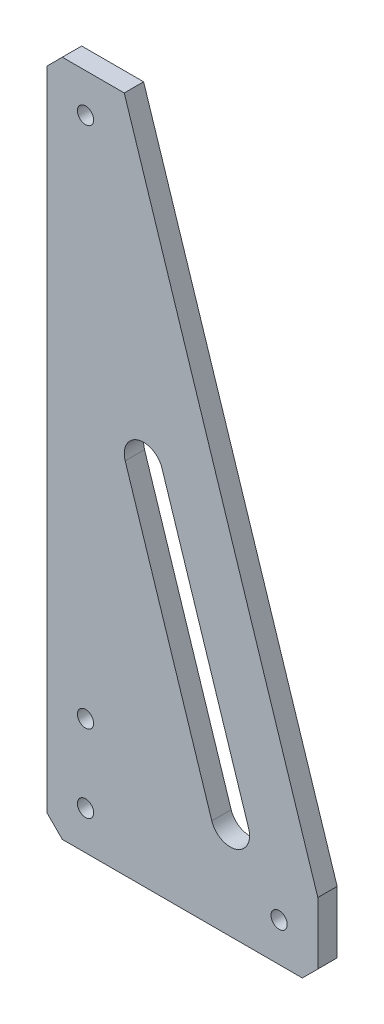
ISO-10303-21;
HEADER;
FILE_DESCRIPTION(('STEP AP214'),'2;1');
FILE_NAME('part.step','',(''),(''),'','','');
FILE_SCHEMA(('AUTOMOTIVE_DESIGN { 1 0 10303 214 1 1 1 1 }'));
ENDSEC;
DATA;
#1=APPLICATION_CONTEXT('core data for automotive mechanical design processes');
#2=APPLICATION_PROTOCOL_DEFINITION('international standard','automotive_design',2000,#1);
#3=PRODUCT_CONTEXT('',#1,'mechanical');
#4=PRODUCT('Part','Part','',(#3));
#5=PRODUCT_RELATED_PRODUCT_CATEGORY('part','',(#4));
#6=PRODUCT_DEFINITION_FORMATION('','',#4);
#7=PRODUCT_DEFINITION_CONTEXT('part definition',#1,'design');
#8=PRODUCT_DEFINITION('design','',#6,#7);
#9=PRODUCT_DEFINITION_SHAPE('','',#8);
#10=(LENGTH_UNIT() NAMED_UNIT(*) SI_UNIT(.MILLI.,.METRE.));
#11=(NAMED_UNIT(*) PLANE_ANGLE_UNIT() SI_UNIT($,.RADIAN.));
#12=(NAMED_UNIT(*) SI_UNIT($,.STERADIAN.) SOLID_ANGLE_UNIT());
#13=UNCERTAINTY_MEASURE_WITH_UNIT(LENGTH_MEASURE(1.E-05),#10,'distance_accuracy_value','');
#14=(GEOMETRIC_REPRESENTATION_CONTEXT(3) GLOBAL_UNCERTAINTY_ASSIGNED_CONTEXT((#13)) GLOBAL_UNIT_ASSIGNED_CONTEXT((#10,
#11,#12)) REPRESENTATION_CONTEXT('',''));
#15=CARTESIAN_POINT('',(0.,0.,0.));
#16=DIRECTION('',(0.,0.,1.));
#17=DIRECTION('',(1.,0.,0.));
#18=AXIS2_PLACEMENT_3D('',#15,#16,#17);
#19=CARTESIAN_POINT('',(0.,0.,2.5));
#20=DIRECTION('',(0.,0.,1.));
#21=DIRECTION('',(1.,0.,0.));
#22=AXIS2_PLACEMENT_3D('',#19,#20,#21);
#23=PLANE('',#22);
#24=CARTESIAN_POINT('',(12.3722613227067,-62.5,2.5));
#25=DIRECTION('',(0.,0.,-1.));
#26=DIRECTION('',(-1.,0.,0.));
#27=AXIS2_PLACEMENT_3D('',#24,#25,#26);
#28=CIRCLE('',#27,5.);
#29=CARTESIAN_POINT('',(17.1308044115095,-60.9649861003862,2.5));
#30=VERTEX_POINT('',#29);
#31=CARTESIAN_POINT('',(7.61371823390396,-64.0350138996138,2.5));
#32=VERTEX_POINT('',#31);
#33=EDGE_CURVE('E129',#30,#32,#28,.T.);
#34=ORIENTED_EDGE('',*,*,#33,.T.);
#35=DIRECTION('',(-0.307002779922759,0.951708617760551,0.));
#36=VECTOR('',#35,1.);
#37=CARTESIAN_POINT('',(7.61371823390396,-64.0350138996138,2.5));
#38=LINE('',#37,#36);
#39=CARTESIAN_POINT('',(-14.7585430888028,5.31899620077691,2.5));
#40=VERTEX_POINT('',#39);
#41=EDGE_CURVE('E138',#32,#40,#38,.T.);
#42=ORIENTED_EDGE('',*,*,#41,.T.);
#43=CARTESIAN_POINT('',(-10.,6.8540101003907,2.5));
#44=DIRECTION('',(0.,0.,-1.));
#45=DIRECTION('',(-1.,0.,0.));
#46=AXIS2_PLACEMENT_3D('',#43,#44,#45);
#47=CIRCLE('',#46,4.99999999999999);
#48=CARTESIAN_POINT('',(-5.24145691119726,8.3890240000045,2.5));
#49=VERTEX_POINT('',#48);
#50=EDGE_CURVE('E53',#40,#49,#47,.T.);
#51=ORIENTED_EDGE('',*,*,#50,.T.);
#52=DIRECTION('',(0.307002779922759,-0.951708617760551,0.));
#53=VECTOR('',#52,1.);
#54=CARTESIAN_POINT('',(17.1308044115095,-60.9649861003862,2.5));
#55=LINE('',#54,#53);
#56=EDGE_CURVE('E135',#49,#30,#55,.T.);
#57=ORIENTED_EDGE('',*,*,#56,.T.);
#58=EDGE_LOOP('',(#34,#42,#51,#57));
#59=FACE_BOUND('',#58,.T.);
#60=CARTESIAN_POINT('',(-25.,77.5,2.5));
#61=DIRECTION('',(0.,0.,1.));
#62=DIRECTION('',(1.,0.,0.));
#63=AXIS2_PLACEMENT_3D('',#60,#61,#62);
#64=CIRCLE('',#63,2.1);
#65=CARTESIAN_POINT('',(-22.9,77.5,2.5));
#66=VERTEX_POINT('',#65);
#67=EDGE_CURVE('E165',#66,#66,#64,.T.);
#68=ORIENTED_EDGE('',*,*,#67,.F.);
#69=EDGE_LOOP('',(#68));
#70=FACE_BOUND('',#69,.T.);
#71=CARTESIAN_POINT('',(25.,-77.5,2.5));
#72=DIRECTION('',(0.,0.,1.));
#73=DIRECTION('',(1.,0.,0.));
#74=AXIS2_PLACEMENT_3D('',#71,#72,#73);
#75=CIRCLE('',#74,2.1);
#76=CARTESIAN_POINT('',(27.1,-77.5,2.5));
#77=VERTEX_POINT('',#76);
#78=EDGE_CURVE('E171',#77,#77,#75,.T.);
#79=ORIENTED_EDGE('',*,*,#78,.F.);
#80=EDGE_LOOP('',(#79));
#81=FACE_BOUND('',#80,.T.);
#82=DIRECTION('',(1.,0.,0.));
#83=VECTOR('',#82,1.);
#84=CARTESIAN_POINT('',(-35.,-87.5,2.5));
#85=LINE('',#84,#83);
#86=CARTESIAN_POINT('',(-31.,-87.5,2.5));
#87=VERTEX_POINT('',#86);
#88=CARTESIAN_POINT('',(31.,-87.5,2.5));
#89=VERTEX_POINT('',#88);
#90=EDGE_CURVE('E175',#87,#89,#85,.T.);
#91=ORIENTED_EDGE('',*,*,#90,.T.);
#92=DIRECTION('',(-0.707106781186551,-0.707106781186544,0.));
#93=VECTOR('',#92,1.);
#94=CARTESIAN_POINT('',(59.2499999999999,-59.2500000000004,2.5));
#95=LINE('',#94,#93);
#96=CARTESIAN_POINT('',(35.,-83.5,2.5));
#97=VERTEX_POINT('',#96);
#98=EDGE_CURVE('E224',#89,#97,#95,.F.);
#99=ORIENTED_EDGE('',*,*,#98,.T.);
#100=DIRECTION('',(0.,1.,0.));
#101=VECTOR('',#100,1.);
#102=CARTESIAN_POINT('',(35.,-87.5,2.5));
#103=LINE('',#102,#101);
#104=CARTESIAN_POINT('',(35.,-67.5,2.5));
#105=VERTEX_POINT('',#104);
#106=EDGE_CURVE('E178',#97,#105,#103,.T.);
#107=ORIENTED_EDGE('',*,*,#106,.T.);
#108=DIRECTION('',(-0.307002779922759,0.951708617760551,0.));
#109=VECTOR('',#108,1.);
#110=CARTESIAN_POINT('',(35.,-67.5,2.5));
#111=LINE('',#110,#109);
#112=CARTESIAN_POINT('',(-15.,87.5,2.5));
#113=VERTEX_POINT('',#112);
#114=EDGE_CURVE('E181',#105,#113,#111,.T.);
#115=ORIENTED_EDGE('',*,*,#114,.T.);
#116=DIRECTION('',(-1.,0.,0.));
#117=VECTOR('',#116,1.);
#118=CARTESIAN_POINT('',(-15.,87.5,2.5));
#119=LINE('',#118,#117);
#120=CARTESIAN_POINT('',(-31.,87.5,2.5));
#121=VERTEX_POINT('',#120);
#122=EDGE_CURVE('E183',#113,#121,#119,.T.);
#123=ORIENTED_EDGE('',*,*,#122,.T.);
#124=DIRECTION('',(0.70710678118655,0.707106781186545,0.));
#125=VECTOR('',#124,1.);
#126=CARTESIAN_POINT('',(-59.2499999999999,59.2500000000003,2.5));
#127=LINE('',#126,#125);
#128=CARTESIAN_POINT('',(-35.,83.5,2.5));
#129=VERTEX_POINT('',#128);
#130=EDGE_CURVE('E220',#121,#129,#127,.F.);
#131=ORIENTED_EDGE('',*,*,#130,.T.);
#132=DIRECTION('',(0.,-1.,0.));
#133=VECTOR('',#132,1.);
#134=CARTESIAN_POINT('',(-35.,87.5,2.5));
#135=LINE('',#134,#133);
#136=CARTESIAN_POINT('',(-35.,-83.5,2.5));
#137=VERTEX_POINT('',#136);
#138=EDGE_CURVE('E186',#129,#137,#135,.T.);
#139=ORIENTED_EDGE('',*,*,#138,.T.);
#140=DIRECTION('',(-0.707106781186545,0.70710678118655,0.));
#141=VECTOR('',#140,1.);
#142=CARTESIAN_POINT('',(-59.2500000000001,-59.2499999999997,2.5));
#143=LINE('',#142,#141);
#144=EDGE_CURVE('E222',#137,#87,#143,.F.);
#145=ORIENTED_EDGE('',*,*,#144,.T.);
#146=EDGE_LOOP('',(#91,#99,#107,#115,#123,#131,#139,#145));
#147=FACE_BOUND('',#146,.T.);
#148=CARTESIAN_POINT('',(-25.,-77.5,2.5));
#149=DIRECTION('',(0.,0.,1.));
#150=DIRECTION('',(1.,0.,0.));
#151=AXIS2_PLACEMENT_3D('',#148,#149,#150);
#152=CIRCLE('',#151,2.1);
#153=CARTESIAN_POINT('',(-22.9,-77.5,2.5));
#154=VERTEX_POINT('',#153);
#155=EDGE_CURVE('E168',#154,#154,#152,.T.);
#156=ORIENTED_EDGE('',*,*,#155,.F.);
#157=EDGE_LOOP('',(#156));
#158=FACE_BOUND('',#157,.T.);
#159=CARTESIAN_POINT('',(-25.,-57.5,2.5));
#160=DIRECTION('',(0.,0.,1.));
#161=DIRECTION('',(1.,0.,0.));
#162=AXIS2_PLACEMENT_3D('',#159,#160,#161);
#163=CIRCLE('',#162,2.1);
#164=CARTESIAN_POINT('',(-22.9,-57.5,2.5));
#165=VERTEX_POINT('',#164);
#166=EDGE_CURVE('E159',#165,#165,#163,.T.);
#167=ORIENTED_EDGE('',*,*,#166,.F.);
#168=EDGE_LOOP('',(#167));
#169=FACE_BOUND('',#168,.T.);
#170=ADVANCED_FACE('F37',(#59,#70,#81,#147,#158,#169),#23,.T.);
#171=CARTESIAN_POINT('',(0.,0.,-2.5));
#172=DIRECTION('',(0.,0.,1.));
#173=DIRECTION('',(1.,0.,0.));
#174=AXIS2_PLACEMENT_3D('',#171,#172,#173);
#175=PLANE('',#174);
#176=DIRECTION('',(-0.307002779922759,0.951708617760551,0.));
#177=VECTOR('',#176,1.);
#178=CARTESIAN_POINT('',(7.61371823390396,-64.0350138996138,-2.5));
#179=LINE('',#178,#177);
#180=CARTESIAN_POINT('',(7.61371823390396,-64.0350138996138,-2.5));
#181=VERTEX_POINT('',#180);
#182=CARTESIAN_POINT('',(-14.7585430888028,5.31899620077691,-2.5));
#183=VERTEX_POINT('',#182);
#184=EDGE_CURVE('E153',#181,#183,#179,.T.);
#185=ORIENTED_EDGE('',*,*,#184,.F.);
#186=CARTESIAN_POINT('',(12.3722613227067,-62.5,-2.5));
#187=DIRECTION('',(0.,0.,-1.));
#188=DIRECTION('',(-1.,0.,0.));
#189=AXIS2_PLACEMENT_3D('',#186,#187,#188);
#190=CIRCLE('',#189,5.);
#191=CARTESIAN_POINT('',(17.1308044115095,-60.9649861003862,-2.5));
#192=VERTEX_POINT('',#191);
#193=EDGE_CURVE('E61',#192,#181,#190,.T.);
#194=ORIENTED_EDGE('',*,*,#193,.F.);
#195=DIRECTION('',(0.307002779922759,-0.951708617760551,0.));
#196=VECTOR('',#195,1.);
#197=CARTESIAN_POINT('',(17.1308044115095,-60.9649861003862,-2.5));
#198=LINE('',#197,#196);
#199=CARTESIAN_POINT('',(-5.24145691119726,8.3890240000045,-2.5));
#200=VERTEX_POINT('',#199);
#201=EDGE_CURVE('E144',#200,#192,#198,.T.);
#202=ORIENTED_EDGE('',*,*,#201,.F.);
#203=CARTESIAN_POINT('',(-10.,6.8540101003907,-2.5));
#204=DIRECTION('',(0.,0.,-1.));
#205=DIRECTION('',(-1.,0.,0.));
#206=AXIS2_PLACEMENT_3D('',#203,#204,#205);
#207=CIRCLE('',#206,4.99999999999999);
#208=EDGE_CURVE('E147',#183,#200,#207,.T.);
#209=ORIENTED_EDGE('',*,*,#208,.F.);
#210=EDGE_LOOP('',(#185,#194,#202,#209));
#211=FACE_BOUND('',#210,.T.);
#212=CARTESIAN_POINT('',(25.,-77.5,-2.5));
#213=DIRECTION('',(0.,0.,1.));
#214=DIRECTION('',(1.,0.,0.));
#215=AXIS2_PLACEMENT_3D('',#212,#213,#214);
#216=CIRCLE('',#215,4.09999999999999);
#217=CARTESIAN_POINT('',(29.1,-77.5,-2.5));
#218=VERTEX_POINT('',#217);
#219=EDGE_CURVE('E242',#218,#218,#216,.T.);
#220=ORIENTED_EDGE('',*,*,#219,.T.);
#221=EDGE_LOOP('',(#220));
#222=FACE_BOUND('',#221,.T.);
#223=CARTESIAN_POINT('',(-25.,-77.5,-2.5));
#224=DIRECTION('',(0.,0.,1.));
#225=DIRECTION('',(1.,0.,0.));
#226=AXIS2_PLACEMENT_3D('',#223,#224,#225);
#227=CIRCLE('',#226,4.09999999999999);
#228=CARTESIAN_POINT('',(-20.9,-77.5,-2.5));
#229=VERTEX_POINT('',#228);
#230=EDGE_CURVE('E239',#229,#229,#227,.T.);
#231=ORIENTED_EDGE('',*,*,#230,.T.);
#232=EDGE_LOOP('',(#231));
#233=FACE_BOUND('',#232,.T.);
#234=CARTESIAN_POINT('',(-25.,-57.5,-2.5));
#235=DIRECTION('',(0.,0.,1.));
#236=DIRECTION('',(1.,0.,0.));
#237=AXIS2_PLACEMENT_3D('',#234,#235,#236);
#238=CIRCLE('',#237,4.10000000000002);
#239=CARTESIAN_POINT('',(-20.9,-57.5,-2.5));
#240=VERTEX_POINT('',#239);
#241=EDGE_CURVE('E236',#240,#240,#238,.T.);
#242=ORIENTED_EDGE('',*,*,#241,.T.);
#243=EDGE_LOOP('',(#242));
#244=FACE_BOUND('',#243,.T.);
#245=CARTESIAN_POINT('',(-25.,77.5,-2.5));
#246=DIRECTION('',(0.,0.,1.));
#247=DIRECTION('',(1.,0.,0.));
#248=AXIS2_PLACEMENT_3D('',#245,#246,#247);
#249=CIRCLE('',#248,4.09999999999999);
#250=CARTESIAN_POINT('',(-20.9,77.5,-2.5));
#251=VERTEX_POINT('',#250);
#252=EDGE_CURVE('E233',#251,#251,#249,.T.);
#253=ORIENTED_EDGE('',*,*,#252,.T.);
#254=EDGE_LOOP('',(#253));
#255=FACE_BOUND('',#254,.T.);
#256=DIRECTION('',(0.,1.,0.));
#257=VECTOR('',#256,1.);
#258=CARTESIAN_POINT('',(35.,-87.5,-2.5));
#259=LINE('',#258,#257);
#260=CARTESIAN_POINT('',(35.,-83.5,-2.5));
#261=VERTEX_POINT('',#260);
#262=CARTESIAN_POINT('',(35.,-67.5,-2.5));
#263=VERTEX_POINT('',#262);
#264=EDGE_CURVE('E192',#261,#263,#259,.T.);
#265=ORIENTED_EDGE('',*,*,#264,.F.);
#266=DIRECTION('',(0.707106781186551,0.707106781186544,0.));
#267=VECTOR('',#266,1.);
#268=CARTESIAN_POINT('',(35.,-83.5,-2.5));
#269=LINE('',#268,#267);
#270=CARTESIAN_POINT('',(31.,-87.5,-2.5));
#271=VERTEX_POINT('',#270);
#272=EDGE_CURVE('E213',#261,#271,#269,.F.);
#273=ORIENTED_EDGE('',*,*,#272,.T.);
#274=DIRECTION('',(1.,0.,0.));
#275=VECTOR('',#274,1.);
#276=CARTESIAN_POINT('',(-35.,-87.5,-2.5));
#277=LINE('',#276,#275);
#278=CARTESIAN_POINT('',(-31.,-87.5,-2.5));
#279=VERTEX_POINT('',#278);
#280=EDGE_CURVE('E174',#279,#271,#277,.T.);
#281=ORIENTED_EDGE('',*,*,#280,.F.);
#282=DIRECTION('',(0.707106781186545,-0.70710678118655,0.));
#283=VECTOR('',#282,1.);
#284=CARTESIAN_POINT('',(-31.,-87.5,-2.5));
#285=LINE('',#284,#283);
#286=CARTESIAN_POINT('',(-35.,-83.5,-2.5));
#287=VERTEX_POINT('',#286);
#288=EDGE_CURVE('E211',#279,#287,#285,.F.);
#289=ORIENTED_EDGE('',*,*,#288,.T.);
#290=DIRECTION('',(0.,-1.,0.));
#291=VECTOR('',#290,1.);
#292=CARTESIAN_POINT('',(-35.,87.5,-2.5));
#293=LINE('',#292,#291);
#294=CARTESIAN_POINT('',(-35.,83.5,-2.5));
#295=VERTEX_POINT('',#294);
#296=EDGE_CURVE('E179',#295,#287,#293,.T.);
#297=ORIENTED_EDGE('',*,*,#296,.F.);
#298=DIRECTION('',(-0.70710678118655,-0.707106781186545,0.));
#299=VECTOR('',#298,1.);
#300=CARTESIAN_POINT('',(-35.,83.5,-2.5));
#301=LINE('',#300,#299);
#302=CARTESIAN_POINT('',(-31.,87.5,-2.5));
#303=VERTEX_POINT('',#302);
#304=EDGE_CURVE('E209',#295,#303,#301,.F.);
#305=ORIENTED_EDGE('',*,*,#304,.T.);
#306=DIRECTION('',(-1.,0.,0.));
#307=VECTOR('',#306,1.);
#308=CARTESIAN_POINT('',(-15.,87.5,-2.5));
#309=LINE('',#308,#307);
#310=CARTESIAN_POINT('',(-15.,87.5,-2.5));
#311=VERTEX_POINT('',#310);
#312=EDGE_CURVE('E196',#311,#303,#309,.T.);
#313=ORIENTED_EDGE('',*,*,#312,.F.);
#314=DIRECTION('',(-0.307002779922759,0.951708617760551,0.));
#315=VECTOR('',#314,1.);
#316=CARTESIAN_POINT('',(35.,-67.5,-2.5));
#317=LINE('',#316,#315);
#318=EDGE_CURVE('E194',#263,#311,#317,.T.);
#319=ORIENTED_EDGE('',*,*,#318,.F.);
#320=EDGE_LOOP('',(#265,#273,#281,#289,#297,#305,#313,#319));
#321=FACE_BOUND('',#320,.T.);
#322=ADVANCED_FACE('F262',(#211,#222,#233,#244,#255,#321),#175,.F.);
#323=CARTESIAN_POINT('',(-35.,-87.5,2.5));
#324=DIRECTION('',(0.,1.,0.));
#325=DIRECTION('',(0.,0.,1.));
#326=AXIS2_PLACEMENT_3D('',#323,#324,#325);
#327=PLANE('',#326);
#328=ORIENTED_EDGE('',*,*,#280,.T.);
#329=DIRECTION('',(0.,0.,1.));
#330=VECTOR('',#329,1.);
#331=CARTESIAN_POINT('',(31.,-87.5,2.5));
#332=LINE('',#331,#330);
#333=EDGE_CURVE('E218',#271,#89,#332,.T.);
#334=ORIENTED_EDGE('',*,*,#333,.T.);
#335=ORIENTED_EDGE('',*,*,#90,.F.);
#336=DIRECTION('',(0.,0.,-1.));
#337=VECTOR('',#336,1.);
#338=CARTESIAN_POINT('',(-31.,-87.5,2.5));
#339=LINE('',#338,#337);
#340=EDGE_CURVE('E215',#87,#279,#339,.T.);
#341=ORIENTED_EDGE('',*,*,#340,.T.);
#342=EDGE_LOOP('',(#328,#334,#335,#341));
#343=FACE_BOUND('',#342,.T.);
#344=ADVANCED_FACE('F265',(#343),#327,.F.);
#345=CARTESIAN_POINT('',(35.,-87.5,2.5));
#346=DIRECTION('',(-1.,0.,0.));
#347=DIRECTION('',(0.,-1.,0.));
#348=AXIS2_PLACEMENT_3D('',#345,#346,#347);
#349=PLANE('',#348);
#350=ORIENTED_EDGE('',*,*,#106,.F.);
#351=DIRECTION('',(0.,0.,-1.));
#352=VECTOR('',#351,1.);
#353=CARTESIAN_POINT('',(35.,-83.5,2.5));
#354=LINE('',#353,#352);
#355=EDGE_CURVE('E206',#97,#261,#354,.T.);
#356=ORIENTED_EDGE('',*,*,#355,.T.);
#357=ORIENTED_EDGE('',*,*,#264,.T.);
#358=DIRECTION('',(0.,0.,-1.));
#359=VECTOR('',#358,1.);
#360=CARTESIAN_POINT('',(35.,-67.5,2.5));
#361=LINE('',#360,#359);
#362=EDGE_CURVE('E203',#105,#263,#361,.T.);
#363=ORIENTED_EDGE('',*,*,#362,.F.);
#364=EDGE_LOOP('',(#350,#356,#357,#363));
#365=FACE_BOUND('',#364,.T.);
#366=ADVANCED_FACE('F277',(#365),#349,.F.);
#367=CARTESIAN_POINT('',(35.,-67.5,2.5));
#368=DIRECTION('',(-0.951708617760551,-0.307002779922759,0.));
#369=DIRECTION('',(0.307002779922759,-0.951708617760551,0.));
#370=AXIS2_PLACEMENT_3D('',#367,#368,#369);
#371=PLANE('',#370);
#372=ORIENTED_EDGE('',*,*,#318,.T.);
#373=DIRECTION('',(0.,0.,-1.));
#374=VECTOR('',#373,1.);
#375=CARTESIAN_POINT('',(-15.,87.5,2.5));
#376=LINE('',#375,#374);
#377=EDGE_CURVE('E189',#113,#311,#376,.T.);
#378=ORIENTED_EDGE('',*,*,#377,.F.);
#379=ORIENTED_EDGE('',*,*,#114,.F.);
#380=ORIENTED_EDGE('',*,*,#362,.T.);
#381=EDGE_LOOP('',(#372,#378,#379,#380));
#382=FACE_BOUND('',#381,.T.);
#383=ADVANCED_FACE('F281',(#382),#371,.F.);
#384=CARTESIAN_POINT('',(-15.,87.5,2.5));
#385=DIRECTION('',(0.,-1.,0.));
#386=DIRECTION('',(0.,0.,-1.));
#387=AXIS2_PLACEMENT_3D('',#384,#385,#386);
#388=PLANE('',#387);
#389=ORIENTED_EDGE('',*,*,#312,.T.);
#390=DIRECTION('',(0.,0.,1.));
#391=VECTOR('',#390,1.);
#392=CARTESIAN_POINT('',(-31.,87.5,2.5));
#393=LINE('',#392,#391);
#394=EDGE_CURVE('E231',#303,#121,#393,.T.);
#395=ORIENTED_EDGE('',*,*,#394,.T.);
#396=ORIENTED_EDGE('',*,*,#122,.F.);
#397=ORIENTED_EDGE('',*,*,#377,.T.);
#398=EDGE_LOOP('',(#389,#395,#396,#397));
#399=FACE_BOUND('',#398,.T.);
#400=ADVANCED_FACE('F307',(#399),#388,.F.);
#401=CARTESIAN_POINT('',(-35.,87.5,2.5));
#402=DIRECTION('',(1.,0.,0.));
#403=DIRECTION('',(0.,0.,-1.));
#404=AXIS2_PLACEMENT_3D('',#401,#402,#403);
#405=PLANE('',#404);
#406=ORIENTED_EDGE('',*,*,#296,.T.);
#407=DIRECTION('',(0.,0.,1.));
#408=VECTOR('',#407,1.);
#409=CARTESIAN_POINT('',(-35.,-83.5,2.5));
#410=LINE('',#409,#408);
#411=EDGE_CURVE('E229',#287,#137,#410,.T.);
#412=ORIENTED_EDGE('',*,*,#411,.T.);
#413=ORIENTED_EDGE('',*,*,#138,.F.);
#414=DIRECTION('',(0.,0.,-1.));
#415=VECTOR('',#414,1.);
#416=CARTESIAN_POINT('',(-35.,83.5,2.5));
#417=LINE('',#416,#415);
#418=EDGE_CURVE('E226',#129,#295,#417,.T.);
#419=ORIENTED_EDGE('',*,*,#418,.T.);
#420=EDGE_LOOP('',(#406,#412,#413,#419));
#421=FACE_BOUND('',#420,.T.);
#422=ADVANCED_FACE('F301',(#421),#405,.F.);
#423=CARTESIAN_POINT('',(25.,-77.5,2.5));
#424=DIRECTION('',(0.,0.,-1.));
#425=DIRECTION('',(-1.,0.,0.));
#426=AXIS2_PLACEMENT_3D('',#423,#424,#425);
#427=CYLINDRICAL_SURFACE('',#426,2.1);
#428=CARTESIAN_POINT('',(25.,-77.5,-0.500000000000014));
#429=DIRECTION('',(0.,0.,1.));
#430=DIRECTION('',(1.,0.,0.));
#431=AXIS2_PLACEMENT_3D('',#428,#429,#430);
#432=CIRCLE('',#431,2.1);
#433=CARTESIAN_POINT('',(27.1,-77.5,-0.500000000000014));
#434=VERTEX_POINT('',#433);
#435=EDGE_CURVE('E245',#434,#434,#432,.F.);
#436=ORIENTED_EDGE('',*,*,#435,.T.);
#437=EDGE_LOOP('',(#436));
#438=FACE_BOUND('',#437,.T.);
#439=ORIENTED_EDGE('',*,*,#78,.T.);
#440=EDGE_LOOP('',(#439));
#441=FACE_BOUND('',#440,.T.);
#442=ADVANCED_FACE('F314',(#438,#441),#427,.F.);
#443=CARTESIAN_POINT('',(-25.,-77.5,2.5));
#444=DIRECTION('',(0.,0.,-1.));
#445=DIRECTION('',(-1.,0.,0.));
#446=AXIS2_PLACEMENT_3D('',#443,#444,#445);
#447=CYLINDRICAL_SURFACE('',#446,2.1);
#448=CARTESIAN_POINT('',(-25.,-77.5,-0.500000000000014));
#449=DIRECTION('',(0.,0.,1.));
#450=DIRECTION('',(1.,0.,0.));
#451=AXIS2_PLACEMENT_3D('',#448,#449,#450);
#452=CIRCLE('',#451,2.1);
#453=CARTESIAN_POINT('',(-22.9,-77.5,-0.500000000000014));
#454=VERTEX_POINT('',#453);
#455=EDGE_CURVE('E248',#454,#454,#452,.F.);
#456=ORIENTED_EDGE('',*,*,#455,.T.);
#457=EDGE_LOOP('',(#456));
#458=FACE_BOUND('',#457,.T.);
#459=ORIENTED_EDGE('',*,*,#155,.T.);
#460=EDGE_LOOP('',(#459));
#461=FACE_BOUND('',#460,.T.);
#462=ADVANCED_FACE('F324',(#458,#461),#447,.F.);
#463=CARTESIAN_POINT('',(-25.,77.5,2.5));
#464=DIRECTION('',(0.,0.,-1.));
#465=DIRECTION('',(-1.,0.,0.));
#466=AXIS2_PLACEMENT_3D('',#463,#464,#465);
#467=CYLINDRICAL_SURFACE('',#466,2.1);
#468=CARTESIAN_POINT('',(-25.,77.5,-0.500000000000014));
#469=DIRECTION('',(0.,0.,1.));
#470=DIRECTION('',(1.,0.,0.));
#471=AXIS2_PLACEMENT_3D('',#468,#469,#470);
#472=CIRCLE('',#471,2.1);
#473=CARTESIAN_POINT('',(-22.9,77.5,-0.500000000000014));
#474=VERTEX_POINT('',#473);
#475=EDGE_CURVE('E11',#474,#474,#472,.F.);
#476=ORIENTED_EDGE('',*,*,#475,.T.);
#477=EDGE_LOOP('',(#476));
#478=FACE_BOUND('',#477,.T.);
#479=ORIENTED_EDGE('',*,*,#67,.T.);
#480=EDGE_LOOP('',(#479));
#481=FACE_BOUND('',#480,.T.);
#482=ADVANCED_FACE('F328',(#478,#481),#467,.F.);
#483=CARTESIAN_POINT('',(-25.,-57.5,2.5));
#484=DIRECTION('',(0.,0.,-1.));
#485=DIRECTION('',(-1.,0.,0.));
#486=AXIS2_PLACEMENT_3D('',#483,#484,#485);
#487=CYLINDRICAL_SURFACE('',#486,2.1);
#488=CARTESIAN_POINT('',(-25.,-57.5,-0.499999999999987));
#489=DIRECTION('',(0.,0.,1.));
#490=DIRECTION('',(1.,0.,0.));
#491=AXIS2_PLACEMENT_3D('',#488,#489,#490);
#492=CIRCLE('',#491,2.1);
#493=CARTESIAN_POINT('',(-22.9,-57.5,-0.499999999999987));
#494=VERTEX_POINT('',#493);
#495=EDGE_CURVE('E46',#494,#494,#492,.F.);
#496=ORIENTED_EDGE('',*,*,#495,.T.);
#497=EDGE_LOOP('',(#496));
#498=FACE_BOUND('',#497,.T.);
#499=ORIENTED_EDGE('',*,*,#166,.T.);
#500=EDGE_LOOP('',(#499));
#501=FACE_BOUND('',#500,.T.);
#502=ADVANCED_FACE('F253',(#498,#501),#487,.F.);
#503=CARTESIAN_POINT('',(35.,-83.5,2.5));
#504=DIRECTION('',(-0.707106781186544,0.707106781186551,0.));
#505=DIRECTION('',(0.,0.,-1.));
#506=AXIS2_PLACEMENT_3D('',#503,#504,#505);
#507=PLANE('',#506);
#508=ORIENTED_EDGE('',*,*,#98,.F.);
#509=ORIENTED_EDGE('',*,*,#333,.F.);
#510=ORIENTED_EDGE('',*,*,#272,.F.);
#511=ORIENTED_EDGE('',*,*,#355,.F.);
#512=EDGE_LOOP('',(#508,#509,#510,#511));
#513=FACE_BOUND('',#512,.T.);
#514=ADVANCED_FACE('F289',(#513),#507,.F.);
#515=CARTESIAN_POINT('',(-31.,-87.5,2.5));
#516=DIRECTION('',(0.70710678118655,0.707106781186545,0.));
#517=DIRECTION('',(0.,0.,-1.));
#518=AXIS2_PLACEMENT_3D('',#515,#516,#517);
#519=PLANE('',#518);
#520=ORIENTED_EDGE('',*,*,#144,.F.);
#521=ORIENTED_EDGE('',*,*,#411,.F.);
#522=ORIENTED_EDGE('',*,*,#288,.F.);
#523=ORIENTED_EDGE('',*,*,#340,.F.);
#524=EDGE_LOOP('',(#520,#521,#522,#523));
#525=FACE_BOUND('',#524,.T.);
#526=ADVANCED_FACE('F298',(#525),#519,.F.);
#527=CARTESIAN_POINT('',(-35.,83.5,2.5));
#528=DIRECTION('',(0.707106781186545,-0.70710678118655,0.));
#529=DIRECTION('',(0.,0.,-1.));
#530=AXIS2_PLACEMENT_3D('',#527,#528,#529);
#531=PLANE('',#530);
#532=ORIENTED_EDGE('',*,*,#130,.F.);
#533=ORIENTED_EDGE('',*,*,#394,.F.);
#534=ORIENTED_EDGE('',*,*,#304,.F.);
#535=ORIENTED_EDGE('',*,*,#418,.F.);
#536=EDGE_LOOP('',(#532,#533,#534,#535));
#537=FACE_BOUND('',#536,.T.);
#538=ADVANCED_FACE('F304',(#537),#531,.F.);
#539=CARTESIAN_POINT('',(25.,-77.5,-2.5));
#540=DIRECTION('',(0.,0.,-1.));
#541=DIRECTION('',(-1.,0.,0.));
#542=AXIS2_PLACEMENT_3D('',#539,#540,#541);
#543=CONICAL_SURFACE('',#542,4.09999999999999,0.78539816339745);
#544=ORIENTED_EDGE('',*,*,#435,.F.);
#545=EDGE_LOOP('',(#544));
#546=FACE_BOUND('',#545,.T.);
#547=ORIENTED_EDGE('',*,*,#219,.F.);
#548=EDGE_LOOP('',(#547));
#549=FACE_BOUND('',#548,.T.);
#550=ADVANCED_FACE('F355',(#546,#549),#543,.F.);
#551=CARTESIAN_POINT('',(-25.,-77.5,-2.5));
#552=DIRECTION('',(0.,0.,-1.));
#553=DIRECTION('',(-1.,0.,0.));
#554=AXIS2_PLACEMENT_3D('',#551,#552,#553);
#555=CONICAL_SURFACE('',#554,4.09999999999999,0.78539816339745);
#556=ORIENTED_EDGE('',*,*,#455,.F.);
#557=EDGE_LOOP('',(#556));
#558=FACE_BOUND('',#557,.T.);
#559=ORIENTED_EDGE('',*,*,#230,.F.);
#560=EDGE_LOOP('',(#559));
#561=FACE_BOUND('',#560,.T.);
#562=ADVANCED_FACE('F259',(#558,#561),#555,.F.);
#563=CARTESIAN_POINT('',(-25.,-57.5,-2.5));
#564=DIRECTION('',(0.,0.,-1.));
#565=DIRECTION('',(-1.,0.,0.));
#566=AXIS2_PLACEMENT_3D('',#563,#564,#565);
#567=CONICAL_SURFACE('',#566,4.10000000000002,0.78539816339745);
#568=ORIENTED_EDGE('',*,*,#495,.F.);
#569=EDGE_LOOP('',(#568));
#570=FACE_BOUND('',#569,.T.);
#571=ORIENTED_EDGE('',*,*,#241,.F.);
#572=EDGE_LOOP('',(#571));
#573=FACE_BOUND('',#572,.T.);
#574=ADVANCED_FACE('F256',(#570,#573),#567,.F.);
#575=CARTESIAN_POINT('',(-25.,77.5,-2.5));
#576=DIRECTION('',(0.,0.,-1.));
#577=DIRECTION('',(-1.,0.,0.));
#578=AXIS2_PLACEMENT_3D('',#575,#576,#577);
#579=CONICAL_SURFACE('',#578,4.09999999999999,0.78539816339745);
#580=ORIENTED_EDGE('',*,*,#475,.F.);
#581=EDGE_LOOP('',(#580));
#582=FACE_BOUND('',#581,.T.);
#583=ORIENTED_EDGE('',*,*,#252,.F.);
#584=EDGE_LOOP('',(#583));
#585=FACE_BOUND('',#584,.T.);
#586=ADVANCED_FACE('F40',(#582,#585),#579,.F.);
#587=CARTESIAN_POINT('',(12.3722613227067,-62.5,2.5));
#588=DIRECTION('',(0.,0.,-1.));
#589=DIRECTION('',(-1.,0.,0.));
#590=AXIS2_PLACEMENT_3D('',#587,#588,#589);
#591=CYLINDRICAL_SURFACE('',#590,5.);
#592=ORIENTED_EDGE('',*,*,#193,.T.);
#593=DIRECTION('',(0.,0.,-1.));
#594=VECTOR('',#593,1.);
#595=CARTESIAN_POINT('',(7.61371823390396,-64.0350138996138,2.5));
#596=LINE('',#595,#594);
#597=EDGE_CURVE('E125',#32,#181,#596,.T.);
#598=ORIENTED_EDGE('',*,*,#597,.F.);
#599=ORIENTED_EDGE('',*,*,#33,.F.);
#600=DIRECTION('',(0.,0.,-1.));
#601=VECTOR('',#600,1.);
#602=CARTESIAN_POINT('',(17.1308044115095,-60.9649861003862,2.5));
#603=LINE('',#602,#601);
#604=EDGE_CURVE('E157',#30,#192,#603,.T.);
#605=ORIENTED_EDGE('',*,*,#604,.T.);
#606=EDGE_LOOP('',(#592,#598,#599,#605));
#607=FACE_BOUND('',#606,.T.);
#608=ADVANCED_FACE('F127',(#607),#591,.F.);
#609=CARTESIAN_POINT('',(17.1308044115095,-60.9649861003862,2.5));
#610=DIRECTION('',(0.951708617760551,0.307002779922759,0.));
#611=DIRECTION('',(-0.307002779922759,0.951708617760551,0.));
#612=AXIS2_PLACEMENT_3D('',#609,#610,#611);
#613=PLANE('',#612);
#614=ORIENTED_EDGE('',*,*,#201,.T.);
#615=ORIENTED_EDGE('',*,*,#604,.F.);
#616=ORIENTED_EDGE('',*,*,#56,.F.);
#617=DIRECTION('',(0.,0.,-1.));
#618=VECTOR('',#617,1.);
#619=CARTESIAN_POINT('',(-5.24145691119726,8.3890240000045,2.5));
#620=LINE('',#619,#618);
#621=EDGE_CURVE('E160',#49,#200,#620,.T.);
#622=ORIENTED_EDGE('',*,*,#621,.T.);
#623=EDGE_LOOP('',(#614,#615,#616,#622));
#624=FACE_BOUND('',#623,.T.);
#625=ADVANCED_FACE('F337',(#624),#613,.F.);
#626=CARTESIAN_POINT('',(-10.,6.8540101003907,2.5));
#627=DIRECTION('',(0.,0.,-1.));
#628=DIRECTION('',(-1.,0.,0.));
#629=AXIS2_PLACEMENT_3D('',#626,#627,#628);
#630=CYLINDRICAL_SURFACE('',#629,4.99999999999999);
#631=ORIENTED_EDGE('',*,*,#208,.T.);
#632=ORIENTED_EDGE('',*,*,#621,.F.);
#633=ORIENTED_EDGE('',*,*,#50,.F.);
#634=DIRECTION('',(0.,0.,-1.));
#635=VECTOR('',#634,1.);
#636=CARTESIAN_POINT('',(-14.7585430888028,5.31899620077691,2.5));
#637=LINE('',#636,#635);
#638=EDGE_CURVE('E134',#40,#183,#637,.T.);
#639=ORIENTED_EDGE('',*,*,#638,.T.);
#640=EDGE_LOOP('',(#631,#632,#633,#639));
#641=FACE_BOUND('',#640,.T.);
#642=ADVANCED_FACE('F340',(#641),#630,.F.);
#643=CARTESIAN_POINT('',(7.61371823390396,-64.0350138996138,2.5));
#644=DIRECTION('',(-0.951708617760551,-0.307002779922759,0.));
#645=DIRECTION('',(0.307002779922759,-0.951708617760551,0.));
#646=AXIS2_PLACEMENT_3D('',#643,#644,#645);
#647=PLANE('',#646);
#648=ORIENTED_EDGE('',*,*,#184,.T.);
#649=ORIENTED_EDGE('',*,*,#638,.F.);
#650=ORIENTED_EDGE('',*,*,#41,.F.);
#651=ORIENTED_EDGE('',*,*,#597,.T.);
#652=EDGE_LOOP('',(#648,#649,#650,#651));
#653=FACE_BOUND('',#652,.T.);
#654=ADVANCED_FACE('F139',(#653),#647,.F.);
#655=CLOSED_SHELL('',(#170,#322,#344,#366,#383,#400,#422,#442,#462,#482,#502,#514,#526,#538,
#550,#562,#574,#586,#608,#625,#642,#654));
#656=MANIFOLD_SOLID_BREP('B2',#655);
#657=ADVANCED_BREP_SHAPE_REPRESENTATION('',(#18,#656),#14);
#658=SHAPE_DEFINITION_REPRESENTATION(#9,#657);
ENDSEC;
END-ISO-10303-21;
